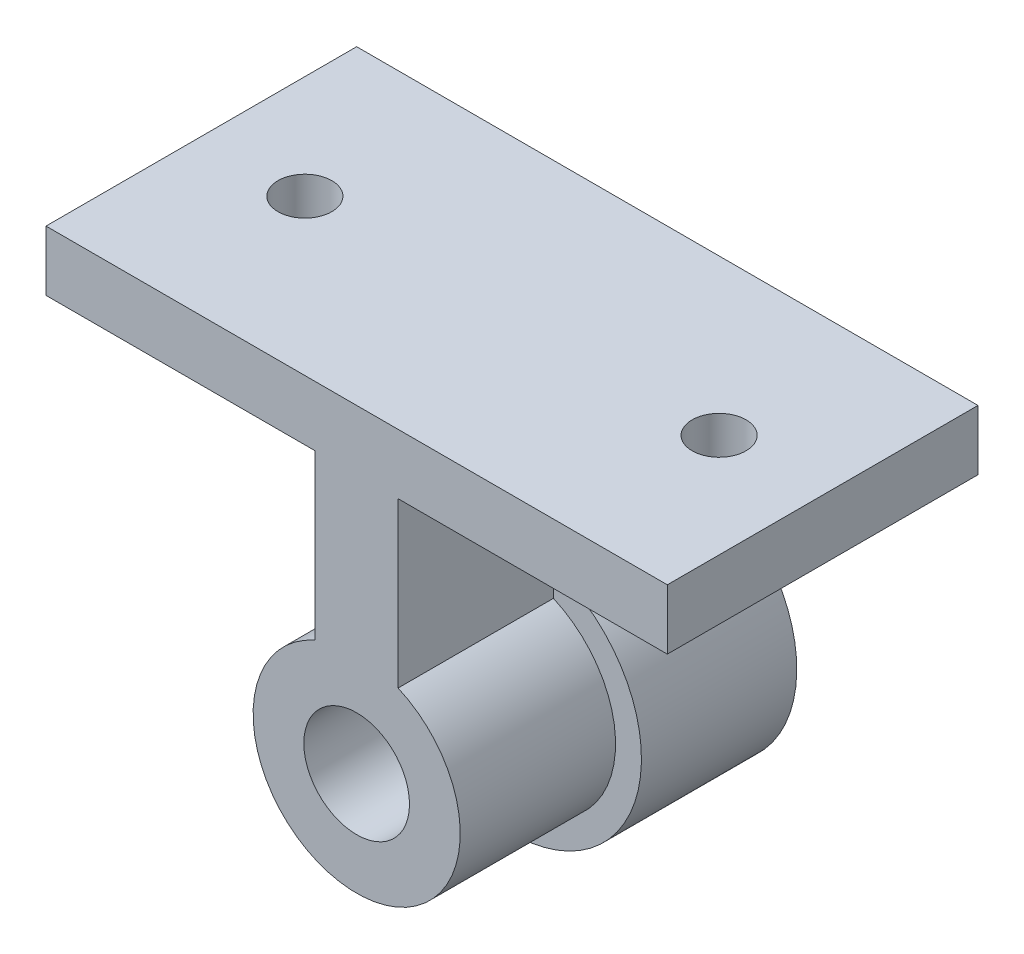
ISO-10303-21;
HEADER;
FILE_DESCRIPTION(('STEP AP214'),'2;1');
FILE_NAME('part.step','',(''),(''),'','','');
FILE_SCHEMA(('AUTOMOTIVE_DESIGN { 1 0 10303 214 1 1 1 1 }'));
ENDSEC;
DATA;
#1=APPLICATION_CONTEXT('core data for automotive mechanical design processes');
#2=APPLICATION_PROTOCOL_DEFINITION('international standard','automotive_design',2000,#1);
#3=PRODUCT_CONTEXT('',#1,'mechanical');
#4=PRODUCT('Part','Part','',(#3));
#5=PRODUCT_RELATED_PRODUCT_CATEGORY('part','',(#4));
#6=PRODUCT_DEFINITION_FORMATION('','',#4);
#7=PRODUCT_DEFINITION_CONTEXT('part definition',#1,'design');
#8=PRODUCT_DEFINITION('design','',#6,#7);
#9=PRODUCT_DEFINITION_SHAPE('','',#8);
#10=(LENGTH_UNIT() NAMED_UNIT(*) SI_UNIT(.MILLI.,.METRE.));
#11=(NAMED_UNIT(*) PLANE_ANGLE_UNIT() SI_UNIT($,.RADIAN.));
#12=(NAMED_UNIT(*) SI_UNIT($,.STERADIAN.) SOLID_ANGLE_UNIT());
#13=UNCERTAINTY_MEASURE_WITH_UNIT(LENGTH_MEASURE(1.E-05),#10,'distance_accuracy_value','');
#14=(GEOMETRIC_REPRESENTATION_CONTEXT(3) GLOBAL_UNCERTAINTY_ASSIGNED_CONTEXT((#13)) GLOBAL_UNIT_ASSIGNED_CONTEXT((#10,
#11,#12)) REPRESENTATION_CONTEXT('',''));
#15=CARTESIAN_POINT('',(0.,0.,0.));
#16=DIRECTION('',(0.,0.,1.));
#17=DIRECTION('',(1.,0.,0.));
#18=AXIS2_PLACEMENT_3D('',#15,#16,#17);
#19=CARTESIAN_POINT('',(0.,-25.,15.));
#20=DIRECTION('',(0.,0.,-1.));
#21=DIRECTION('',(-1.,0.,0.));
#22=AXIS2_PLACEMENT_3D('',#19,#20,#21);
#23=CYLINDRICAL_SURFACE('',#22,5.1);
#24=CARTESIAN_POINT('',(0.,-25.,15.));
#25=DIRECTION('',(0.,0.,1.));
#26=DIRECTION('',(1.,0.,0.));
#27=AXIS2_PLACEMENT_3D('',#24,#25,#26);
#28=CIRCLE('',#27,5.1);
#29=CARTESIAN_POINT('',(5.1,-25.,15.));
#30=VERTEX_POINT('',#29);
#31=EDGE_CURVE('E188',#30,#30,#28,.T.);
#32=ORIENTED_EDGE('',*,*,#31,.T.);
#33=EDGE_LOOP('',(#32));
#34=FACE_BOUND('',#33,.T.);
#35=CARTESIAN_POINT('',(0.,-25.,-4.));
#36=DIRECTION('',(0.,0.,-1.));
#37=DIRECTION('',(-1.,0.,0.));
#38=AXIS2_PLACEMENT_3D('',#35,#36,#37);
#39=CIRCLE('',#38,5.1);
#40=CARTESIAN_POINT('',(-5.1,-25.,-4.));
#41=VERTEX_POINT('',#40);
#42=EDGE_CURVE('E43',#41,#41,#39,.T.);
#43=ORIENTED_EDGE('',*,*,#42,.T.);
#44=EDGE_LOOP('',(#43));
#45=FACE_BOUND('',#44,.T.);
#46=ADVANCED_FACE('F39',(#34,#45),#23,.F.);
#47=CARTESIAN_POINT('',(0.,0.,0.));
#48=DIRECTION('',(0.,1.,0.));
#49=DIRECTION('',(0.,0.,1.));
#50=AXIS2_PLACEMENT_3D('',#47,#48,#49);
#51=PLANE('',#50);
#52=CARTESIAN_POINT('',(-20.,0.,0.));
#53=DIRECTION('',(0.,1.,0.));
#54=DIRECTION('',(0.,0.,1.));
#55=AXIS2_PLACEMENT_3D('',#52,#53,#54);
#56=CIRCLE('',#55,2.6);
#57=CARTESIAN_POINT('',(-20.,0.,2.6));
#58=VERTEX_POINT('',#57);
#59=EDGE_CURVE('E243',#58,#58,#56,.T.);
#60=ORIENTED_EDGE('',*,*,#59,.T.);
#61=EDGE_LOOP('',(#60));
#62=FACE_BOUND('',#61,.T.);
#63=DIRECTION('',(-1.,0.,0.));
#64=VECTOR('',#63,1.);
#65=CARTESIAN_POINT('',(-30.,0.,-15.));
#66=LINE('',#65,#64);
#67=CARTESIAN_POINT('',(-6.,0.,-15.));
#68=VERTEX_POINT('',#67);
#69=CARTESIAN_POINT('',(-30.,0.,-15.));
#70=VERTEX_POINT('',#69);
#71=EDGE_CURVE('E267',#68,#70,#66,.T.);
#72=ORIENTED_EDGE('',*,*,#71,.F.);
#73=DIRECTION('',(0.,0.,1.));
#74=VECTOR('',#73,1.);
#75=CARTESIAN_POINT('',(-6.,0.,-15.));
#76=LINE('',#75,#74);
#77=CARTESIAN_POINT('',(-6.,0.,0.));
#78=VERTEX_POINT('',#77);
#79=EDGE_CURVE('E189',#68,#78,#76,.T.);
#80=ORIENTED_EDGE('',*,*,#79,.T.);
#81=DIRECTION('',(-1.,0.,0.));
#82=VECTOR('',#81,1.);
#83=CARTESIAN_POINT('',(-6.,0.,0.));
#84=LINE('',#83,#82);
#85=CARTESIAN_POINT('',(-4.,0.,0.));
#86=VERTEX_POINT('',#85);
#87=EDGE_CURVE('E183',#86,#78,#84,.T.);
#88=ORIENTED_EDGE('',*,*,#87,.F.);
#89=DIRECTION('',(0.,0.,-1.));
#90=VECTOR('',#89,1.);
#91=CARTESIAN_POINT('',(-4.,0.,15.));
#92=LINE('',#91,#90);
#93=CARTESIAN_POINT('',(-4.,0.,15.));
#94=VERTEX_POINT('',#93);
#95=EDGE_CURVE('E227',#94,#86,#92,.T.);
#96=ORIENTED_EDGE('',*,*,#95,.F.);
#97=DIRECTION('',(1.,0.,0.));
#98=VECTOR('',#97,1.);
#99=CARTESIAN_POINT('',(-30.,0.,15.));
#100=LINE('',#99,#98);
#101=CARTESIAN_POINT('',(-30.,0.,15.));
#102=VERTEX_POINT('',#101);
#103=EDGE_CURVE('E255',#102,#94,#100,.T.);
#104=ORIENTED_EDGE('',*,*,#103,.F.);
#105=DIRECTION('',(0.,0.,1.));
#106=VECTOR('',#105,1.);
#107=CARTESIAN_POINT('',(-30.,0.,-15.));
#108=LINE('',#107,#106);
#109=EDGE_CURVE('E76',#70,#102,#108,.T.);
#110=ORIENTED_EDGE('',*,*,#109,.F.);
#111=EDGE_LOOP('',(#72,#80,#88,#96,#104,#110));
#112=FACE_BOUND('',#111,.T.);
#113=ADVANCED_FACE('F286',(#62,#112),#51,.F.);
#114=CARTESIAN_POINT('',(20.,0.,0.));
#115=DIRECTION('',(0.,-1.,0.));
#116=DIRECTION('',(0.,0.,1.));
#117=AXIS2_PLACEMENT_3D('',#114,#115,#116);
#118=CIRCLE('',#117,2.6);
#119=CARTESIAN_POINT('',(20.,0.,2.6));
#120=VERTEX_POINT('',#119);
#121=EDGE_CURVE('E235',#120,#120,#118,.T.);
#122=ORIENTED_EDGE('',*,*,#121,.F.);
#123=EDGE_LOOP('',(#122));
#124=FACE_BOUND('',#123,.T.);
#125=CARTESIAN_POINT('',(6.,0.,0.));
#126=VERTEX_POINT('',#125);
#127=CARTESIAN_POINT('',(4.,0.,0.));
#128=VERTEX_POINT('',#127);
#129=EDGE_CURVE('E170',#126,#128,#84,.T.);
#130=ORIENTED_EDGE('',*,*,#129,.F.);
#131=DIRECTION('',(0.,0.,1.));
#132=VECTOR('',#131,1.);
#133=CARTESIAN_POINT('',(6.,0.,-15.));
#134=LINE('',#133,#132);
#135=CARTESIAN_POINT('',(6.,0.,-15.));
#136=VERTEX_POINT('',#135);
#137=EDGE_CURVE('E151',#136,#126,#134,.T.);
#138=ORIENTED_EDGE('',*,*,#137,.F.);
#139=CARTESIAN_POINT('',(30.,0.,-15.));
#140=VERTEX_POINT('',#139);
#141=EDGE_CURVE('E160',#140,#136,#66,.T.);
#142=ORIENTED_EDGE('',*,*,#141,.F.);
#143=DIRECTION('',(0.,0.,-1.));
#144=VECTOR('',#143,1.);
#145=CARTESIAN_POINT('',(30.,0.,-15.));
#146=LINE('',#145,#144);
#147=CARTESIAN_POINT('',(30.,0.,15.));
#148=VERTEX_POINT('',#147);
#149=EDGE_CURVE('E251',#148,#140,#146,.T.);
#150=ORIENTED_EDGE('',*,*,#149,.F.);
#151=CARTESIAN_POINT('',(4.,0.,15.));
#152=VERTEX_POINT('',#151);
#153=EDGE_CURVE('E83',#152,#148,#100,.T.);
#154=ORIENTED_EDGE('',*,*,#153,.F.);
#155=DIRECTION('',(0.,0.,-1.));
#156=VECTOR('',#155,1.);
#157=CARTESIAN_POINT('',(4.,0.,15.));
#158=LINE('',#157,#156);
#159=EDGE_CURVE('E231',#152,#128,#158,.T.);
#160=ORIENTED_EDGE('',*,*,#159,.T.);
#161=EDGE_LOOP('',(#130,#138,#142,#150,#154,#160));
#162=FACE_BOUND('',#161,.T.);
#163=ADVANCED_FACE('F318',(#124,#162),#51,.F.);
#164=CARTESIAN_POINT('',(30.,5.8,-15.));
#165=DIRECTION('',(-1.,0.,0.));
#166=DIRECTION('',(0.,0.,1.));
#167=AXIS2_PLACEMENT_3D('',#164,#165,#166);
#168=PLANE('',#167);
#169=ORIENTED_EDGE('',*,*,#149,.T.);
#170=DIRECTION('',(0.,-1.,0.));
#171=VECTOR('',#170,1.);
#172=CARTESIAN_POINT('',(30.,5.8,-15.));
#173=LINE('',#172,#171);
#174=CARTESIAN_POINT('',(30.,5.8,-15.));
#175=VERTEX_POINT('',#174);
#176=EDGE_CURVE('E11',#175,#140,#173,.T.);
#177=ORIENTED_EDGE('',*,*,#176,.F.);
#178=DIRECTION('',(0.,0.,-1.));
#179=VECTOR('',#178,1.);
#180=CARTESIAN_POINT('',(30.,5.8,-15.));
#181=LINE('',#180,#179);
#182=CARTESIAN_POINT('',(30.,5.8,15.));
#183=VERTEX_POINT('',#182);
#184=EDGE_CURVE('E252',#183,#175,#181,.T.);
#185=ORIENTED_EDGE('',*,*,#184,.F.);
#186=DIRECTION('',(0.,-1.,0.));
#187=VECTOR('',#186,1.);
#188=CARTESIAN_POINT('',(30.,5.8,15.));
#189=LINE('',#188,#187);
#190=EDGE_CURVE('E263',#183,#148,#189,.T.);
#191=ORIENTED_EDGE('',*,*,#190,.T.);
#192=EDGE_LOOP('',(#169,#177,#185,#191));
#193=FACE_BOUND('',#192,.T.);
#194=ADVANCED_FACE('F41',(#193),#168,.F.);
#195=CARTESIAN_POINT('',(-30.,5.8,-15.));
#196=DIRECTION('',(0.,0.,1.));
#197=DIRECTION('',(1.,0.,0.));
#198=AXIS2_PLACEMENT_3D('',#195,#196,#197);
#199=PLANE('',#198);
#200=CARTESIAN_POINT('',(0.,-25.,-15.));
#201=DIRECTION('',(0.,0.,-1.));
#202=DIRECTION('',(-1.,0.,0.));
#203=AXIS2_PLACEMENT_3D('',#200,#201,#202);
#204=CIRCLE('',#203,10.75);
#205=CARTESIAN_POINT('',(-10.75,-25.,-15.));
#206=VERTEX_POINT('',#205);
#207=EDGE_CURVE('E173',#206,#206,#204,.T.);
#208=ORIENTED_EDGE('',*,*,#207,.F.);
#209=EDGE_LOOP('',(#208));
#210=FACE_BOUND('',#209,.T.);
#211=ORIENTED_EDGE('',*,*,#141,.T.);
#212=DIRECTION('',(0.,1.,0.));
#213=VECTOR('',#212,1.);
#214=CARTESIAN_POINT('',(6.,-14.0341439002693,-15.));
#215=LINE('',#214,#213);
#216=CARTESIAN_POINT('',(6.,-14.0341439002693,-15.));
#217=VERTEX_POINT('',#216);
#218=EDGE_CURVE('E142',#217,#136,#215,.T.);
#219=ORIENTED_EDGE('',*,*,#218,.F.);
#220=CARTESIAN_POINT('',(0.,-25.,-15.));
#221=DIRECTION('',(0.,0.,1.));
#222=DIRECTION('',(1.,0.,0.));
#223=AXIS2_PLACEMENT_3D('',#220,#221,#222);
#224=CIRCLE('',#223,12.5);
#225=CARTESIAN_POINT('',(-6.,-14.0341439002693,-15.));
#226=VERTEX_POINT('',#225);
#227=EDGE_CURVE('E158',#226,#217,#224,.T.);
#228=ORIENTED_EDGE('',*,*,#227,.F.);
#229=DIRECTION('',(0.,-1.,0.));
#230=VECTOR('',#229,1.);
#231=CARTESIAN_POINT('',(-6.,-14.0341439002693,-15.));
#232=LINE('',#231,#230);
#233=EDGE_CURVE('E152',#68,#226,#232,.T.);
#234=ORIENTED_EDGE('',*,*,#233,.F.);
#235=ORIENTED_EDGE('',*,*,#71,.T.);
#236=DIRECTION('',(0.,-1.,0.));
#237=VECTOR('',#236,1.);
#238=CARTESIAN_POINT('',(-30.,5.8,-15.));
#239=LINE('',#238,#237);
#240=CARTESIAN_POINT('',(-30.,5.8,-15.));
#241=VERTEX_POINT('',#240);
#242=EDGE_CURVE('E50',#241,#70,#239,.T.);
#243=ORIENTED_EDGE('',*,*,#242,.F.);
#244=DIRECTION('',(-1.,0.,0.));
#245=VECTOR('',#244,1.);
#246=CARTESIAN_POINT('',(-30.,5.8,-15.));
#247=LINE('',#246,#245);
#248=EDGE_CURVE('E90',#175,#241,#247,.T.);
#249=ORIENTED_EDGE('',*,*,#248,.F.);
#250=ORIENTED_EDGE('',*,*,#176,.T.);
#251=EDGE_LOOP('',(#211,#219,#228,#234,#235,#243,#249,#250));
#252=FACE_BOUND('',#251,.T.);
#253=ADVANCED_FACE('F156',(#210,#252),#199,.F.);
#254=CARTESIAN_POINT('',(-30.,5.8,-15.));
#255=DIRECTION('',(1.,0.,0.));
#256=DIRECTION('',(0.,0.,-1.));
#257=AXIS2_PLACEMENT_3D('',#254,#255,#256);
#258=PLANE('',#257);
#259=ORIENTED_EDGE('',*,*,#109,.T.);
#260=DIRECTION('',(0.,-1.,0.));
#261=VECTOR('',#260,1.);
#262=CARTESIAN_POINT('',(-30.,5.8,15.));
#263=LINE('',#262,#261);
#264=CARTESIAN_POINT('',(-30.,5.8,15.));
#265=VERTEX_POINT('',#264);
#266=EDGE_CURVE('E277',#265,#102,#263,.T.);
#267=ORIENTED_EDGE('',*,*,#266,.F.);
#268=DIRECTION('',(0.,0.,1.));
#269=VECTOR('',#268,1.);
#270=CARTESIAN_POINT('',(-30.,5.8,-15.));
#271=LINE('',#270,#269);
#272=EDGE_CURVE('E258',#241,#265,#271,.T.);
#273=ORIENTED_EDGE('',*,*,#272,.F.);
#274=ORIENTED_EDGE('',*,*,#242,.T.);
#275=EDGE_LOOP('',(#259,#267,#273,#274));
#276=FACE_BOUND('',#275,.T.);
#277=ADVANCED_FACE('F282',(#276),#258,.F.);
#278=CARTESIAN_POINT('',(-30.,5.8,15.));
#279=DIRECTION('',(0.,0.,-1.));
#280=DIRECTION('',(-1.,0.,0.));
#281=AXIS2_PLACEMENT_3D('',#278,#279,#280);
#282=PLANE('',#281);
#283=ORIENTED_EDGE('',*,*,#103,.T.);
#284=DIRECTION('',(0.,-1.,0.));
#285=VECTOR('',#284,1.);
#286=CARTESIAN_POINT('',(-4.,-15.8348486100883,15.));
#287=LINE('',#286,#285);
#288=CARTESIAN_POINT('',(-4.,-15.8348486100883,15.));
#289=VERTEX_POINT('',#288);
#290=EDGE_CURVE('E202',#94,#289,#287,.T.);
#291=ORIENTED_EDGE('',*,*,#290,.T.);
#292=CARTESIAN_POINT('',(0.,-25.,15.));
#293=DIRECTION('',(0.,0.,1.));
#294=DIRECTION('',(1.,0.,0.));
#295=AXIS2_PLACEMENT_3D('',#292,#293,#294);
#296=CIRCLE('',#295,10.);
#297=CARTESIAN_POINT('',(4.,-15.8348486100883,15.));
#298=VERTEX_POINT('',#297);
#299=EDGE_CURVE('E206',#289,#298,#296,.T.);
#300=ORIENTED_EDGE('',*,*,#299,.T.);
#301=DIRECTION('',(0.,1.,0.));
#302=VECTOR('',#301,1.);
#303=CARTESIAN_POINT('',(4.,-15.8348486100883,15.));
#304=LINE('',#303,#302);
#305=EDGE_CURVE('E199',#298,#152,#304,.T.);
#306=ORIENTED_EDGE('',*,*,#305,.T.);
#307=ORIENTED_EDGE('',*,*,#153,.T.);
#308=ORIENTED_EDGE('',*,*,#190,.F.);
#309=DIRECTION('',(1.,0.,0.));
#310=VECTOR('',#309,1.);
#311=CARTESIAN_POINT('',(-30.,5.8,15.));
#312=LINE('',#311,#310);
#313=EDGE_CURVE('E58',#265,#183,#312,.T.);
#314=ORIENTED_EDGE('',*,*,#313,.F.);
#315=ORIENTED_EDGE('',*,*,#266,.T.);
#316=EDGE_LOOP('',(#283,#291,#300,#306,#307,#308,#314,#315));
#317=FACE_BOUND('',#316,.T.);
#318=ORIENTED_EDGE('',*,*,#31,.F.);
#319=EDGE_LOOP('',(#318));
#320=FACE_BOUND('',#319,.T.);
#321=ADVANCED_FACE('F289',(#317,#320),#282,.F.);
#322=CARTESIAN_POINT('',(0.,5.8,0.));
#323=DIRECTION('',(0.,1.,0.));
#324=DIRECTION('',(0.,0.,1.));
#325=AXIS2_PLACEMENT_3D('',#322,#323,#324);
#326=PLANE('',#325);
#327=CARTESIAN_POINT('',(20.,5.8,0.));
#328=DIRECTION('',(0.,1.,0.));
#329=DIRECTION('',(0.,0.,1.));
#330=AXIS2_PLACEMENT_3D('',#327,#328,#329);
#331=CIRCLE('',#330,2.6);
#332=CARTESIAN_POINT('',(20.,5.8,2.6));
#333=VERTEX_POINT('',#332);
#334=EDGE_CURVE('E239',#333,#333,#331,.T.);
#335=ORIENTED_EDGE('',*,*,#334,.F.);
#336=EDGE_LOOP('',(#335));
#337=FACE_BOUND('',#336,.T.);
#338=CARTESIAN_POINT('',(-20.,5.8,0.));
#339=DIRECTION('',(0.,1.,0.));
#340=DIRECTION('',(0.,0.,1.));
#341=AXIS2_PLACEMENT_3D('',#338,#339,#340);
#342=CIRCLE('',#341,2.6);
#343=CARTESIAN_POINT('',(-20.,5.8,2.6));
#344=VERTEX_POINT('',#343);
#345=EDGE_CURVE('E247',#344,#344,#342,.F.);
#346=ORIENTED_EDGE('',*,*,#345,.T.);
#347=EDGE_LOOP('',(#346));
#348=FACE_BOUND('',#347,.T.);
#349=ORIENTED_EDGE('',*,*,#184,.T.);
#350=ORIENTED_EDGE('',*,*,#248,.T.);
#351=ORIENTED_EDGE('',*,*,#272,.T.);
#352=ORIENTED_EDGE('',*,*,#313,.T.);
#353=EDGE_LOOP('',(#349,#350,#351,#352));
#354=FACE_BOUND('',#353,.T.);
#355=ADVANCED_FACE('F296',(#337,#348,#354),#326,.T.);
#356=CARTESIAN_POINT('',(-20.,6.,0.));
#357=DIRECTION('',(0.,-1.,0.));
#358=DIRECTION('',(0.,0.,-1.));
#359=AXIS2_PLACEMENT_3D('',#356,#357,#358);
#360=CYLINDRICAL_SURFACE('',#359,2.6);
#361=ORIENTED_EDGE('',*,*,#345,.F.);
#362=EDGE_LOOP('',(#361));
#363=FACE_BOUND('',#362,.T.);
#364=ORIENTED_EDGE('',*,*,#59,.F.);
#365=EDGE_LOOP('',(#364));
#366=FACE_BOUND('',#365,.T.);
#367=ADVANCED_FACE('F298',(#363,#366),#360,.F.);
#368=CARTESIAN_POINT('',(20.,6.,0.));
#369=DIRECTION('',(0.,-1.,0.));
#370=DIRECTION('',(0.,0.,-1.));
#371=AXIS2_PLACEMENT_3D('',#368,#369,#370);
#372=CYLINDRICAL_SURFACE('',#371,2.6);
#373=ORIENTED_EDGE('',*,*,#334,.T.);
#374=EDGE_LOOP('',(#373));
#375=FACE_BOUND('',#374,.T.);
#376=ORIENTED_EDGE('',*,*,#121,.T.);
#377=EDGE_LOOP('',(#376));
#378=FACE_BOUND('',#377,.T.);
#379=ADVANCED_FACE('F305',(#375,#378),#372,.F.);
#380=CARTESIAN_POINT('',(4.,-15.8348486100883,15.));
#381=DIRECTION('',(-1.,0.,0.));
#382=DIRECTION('',(0.,0.,1.));
#383=AXIS2_PLACEMENT_3D('',#380,#381,#382);
#384=PLANE('',#383);
#385=DIRECTION('',(0.,1.,0.));
#386=VECTOR('',#385,1.);
#387=CARTESIAN_POINT('',(4.,-15.8348486100883,0.));
#388=LINE('',#387,#386);
#389=CARTESIAN_POINT('',(4.,-15.8348486100883,0.));
#390=VERTEX_POINT('',#389);
#391=EDGE_CURVE('E198',#390,#128,#388,.T.);
#392=ORIENTED_EDGE('',*,*,#391,.T.);
#393=ORIENTED_EDGE('',*,*,#159,.F.);
#394=ORIENTED_EDGE('',*,*,#305,.F.);
#395=DIRECTION('',(0.,0.,-1.));
#396=VECTOR('',#395,1.);
#397=CARTESIAN_POINT('',(4.,-15.8348486100883,15.));
#398=LINE('',#397,#396);
#399=EDGE_CURVE('E209',#298,#390,#398,.T.);
#400=ORIENTED_EDGE('',*,*,#399,.T.);
#401=EDGE_LOOP('',(#392,#393,#394,#400));
#402=FACE_BOUND('',#401,.T.);
#403=ADVANCED_FACE('F332',(#402),#384,.F.);
#404=CARTESIAN_POINT('',(-4.,-15.8348486100883,15.));
#405=DIRECTION('',(1.,0.,0.));
#406=DIRECTION('',(0.,1.,0.));
#407=AXIS2_PLACEMENT_3D('',#404,#405,#406);
#408=PLANE('',#407);
#409=DIRECTION('',(0.,-1.,0.));
#410=VECTOR('',#409,1.);
#411=CARTESIAN_POINT('',(-4.,-15.8348486100883,0.));
#412=LINE('',#411,#410);
#413=CARTESIAN_POINT('',(-4.,-15.8348486100883,0.));
#414=VERTEX_POINT('',#413);
#415=EDGE_CURVE('E213',#86,#414,#412,.T.);
#416=ORIENTED_EDGE('',*,*,#415,.T.);
#417=DIRECTION('',(0.,0.,-1.));
#418=VECTOR('',#417,1.);
#419=CARTESIAN_POINT('',(-4.,-15.8348486100883,15.));
#420=LINE('',#419,#418);
#421=EDGE_CURVE('E223',#289,#414,#420,.T.);
#422=ORIENTED_EDGE('',*,*,#421,.F.);
#423=ORIENTED_EDGE('',*,*,#290,.F.);
#424=ORIENTED_EDGE('',*,*,#95,.T.);
#425=EDGE_LOOP('',(#416,#422,#423,#424));
#426=FACE_BOUND('',#425,.T.);
#427=ADVANCED_FACE('F328',(#426),#408,.F.);
#428=CARTESIAN_POINT('',(0.,-25.,15.));
#429=DIRECTION('',(0.,0.,-1.));
#430=DIRECTION('',(-1.,0.,0.));
#431=AXIS2_PLACEMENT_3D('',#428,#429,#430);
#432=CYLINDRICAL_SURFACE('',#431,10.);
#433=CARTESIAN_POINT('',(0.,-25.,0.));
#434=DIRECTION('',(0.,0.,1.));
#435=DIRECTION('',(1.,0.,0.));
#436=AXIS2_PLACEMENT_3D('',#433,#434,#435);
#437=CIRCLE('',#436,10.);
#438=EDGE_CURVE('E203',#414,#390,#437,.T.);
#439=ORIENTED_EDGE('',*,*,#438,.T.);
#440=ORIENTED_EDGE('',*,*,#399,.F.);
#441=ORIENTED_EDGE('',*,*,#299,.F.);
#442=ORIENTED_EDGE('',*,*,#421,.T.);
#443=EDGE_LOOP('',(#439,#440,#441,#442));
#444=FACE_BOUND('',#443,.T.);
#445=ADVANCED_FACE('F324',(#444),#432,.T.);
#446=CARTESIAN_POINT('',(0.,-25.,0.));
#447=DIRECTION('',(0.,0.,1.));
#448=DIRECTION('',(1.,0.,0.));
#449=AXIS2_PLACEMENT_3D('',#446,#447,#448);
#450=PLANE('',#449);
#451=ORIENTED_EDGE('',*,*,#391,.F.);
#452=ORIENTED_EDGE('',*,*,#438,.F.);
#453=ORIENTED_EDGE('',*,*,#415,.F.);
#454=ORIENTED_EDGE('',*,*,#87,.T.);
#455=DIRECTION('',(0.,-1.,0.));
#456=VECTOR('',#455,1.);
#457=CARTESIAN_POINT('',(-6.,-14.0341439002693,0.));
#458=LINE('',#457,#456);
#459=CARTESIAN_POINT('',(-6.,-14.0341439002693,0.));
#460=VERTEX_POINT('',#459);
#461=EDGE_CURVE('E166',#78,#460,#458,.T.);
#462=ORIENTED_EDGE('',*,*,#461,.T.);
#463=CARTESIAN_POINT('',(0.,-25.,0.));
#464=DIRECTION('',(0.,0.,1.));
#465=DIRECTION('',(1.,0.,0.));
#466=AXIS2_PLACEMENT_3D('',#463,#464,#465);
#467=CIRCLE('',#466,12.5);
#468=CARTESIAN_POINT('',(6.,-14.0341439002693,0.));
#469=VERTEX_POINT('',#468);
#470=EDGE_CURVE('E178',#460,#469,#467,.T.);
#471=ORIENTED_EDGE('',*,*,#470,.T.);
#472=DIRECTION('',(0.,1.,0.));
#473=VECTOR('',#472,1.);
#474=CARTESIAN_POINT('',(6.,-14.0341439002693,0.));
#475=LINE('',#474,#473);
#476=EDGE_CURVE('E145',#469,#126,#475,.T.);
#477=ORIENTED_EDGE('',*,*,#476,.T.);
#478=ORIENTED_EDGE('',*,*,#129,.T.);
#479=EDGE_LOOP('',(#451,#452,#453,#454,#462,#471,#477,#478));
#480=FACE_BOUND('',#479,.T.);
#481=ADVANCED_FACE('F327',(#480),#450,.T.);
#482=CARTESIAN_POINT('',(0.,-25.,-15.));
#483=DIRECTION('',(0.,0.,1.));
#484=DIRECTION('',(1.,0.,0.));
#485=AXIS2_PLACEMENT_3D('',#482,#483,#484);
#486=CYLINDRICAL_SURFACE('',#485,12.5);
#487=ORIENTED_EDGE('',*,*,#470,.F.);
#488=DIRECTION('',(0.,0.,1.));
#489=VECTOR('',#488,1.);
#490=CARTESIAN_POINT('',(-6.,-14.0341439002693,-15.));
#491=LINE('',#490,#489);
#492=EDGE_CURVE('E164',#226,#460,#491,.T.);
#493=ORIENTED_EDGE('',*,*,#492,.F.);
#494=ORIENTED_EDGE('',*,*,#227,.T.);
#495=DIRECTION('',(0.,0.,1.));
#496=VECTOR('',#495,1.);
#497=CARTESIAN_POINT('',(6.,-14.0341439002693,-15.));
#498=LINE('',#497,#496);
#499=EDGE_CURVE('E139',#217,#469,#498,.T.);
#500=ORIENTED_EDGE('',*,*,#499,.T.);
#501=EDGE_LOOP('',(#487,#493,#494,#500));
#502=FACE_BOUND('',#501,.T.);
#503=ADVANCED_FACE('F163',(#502),#486,.T.);
#504=CARTESIAN_POINT('',(-6.,-14.0341439002693,-15.));
#505=DIRECTION('',(-1.,0.,0.));
#506=DIRECTION('',(0.,0.,1.));
#507=AXIS2_PLACEMENT_3D('',#504,#505,#506);
#508=PLANE('',#507);
#509=ORIENTED_EDGE('',*,*,#461,.F.);
#510=ORIENTED_EDGE('',*,*,#79,.F.);
#511=ORIENTED_EDGE('',*,*,#233,.T.);
#512=ORIENTED_EDGE('',*,*,#492,.T.);
#513=EDGE_LOOP('',(#509,#510,#511,#512));
#514=FACE_BOUND('',#513,.T.);
#515=ADVANCED_FACE('F441',(#514),#508,.T.);
#516=CARTESIAN_POINT('',(6.,-14.0341439002693,-15.));
#517=DIRECTION('',(1.,0.,0.));
#518=DIRECTION('',(0.,1.,0.));
#519=AXIS2_PLACEMENT_3D('',#516,#517,#518);
#520=PLANE('',#519);
#521=ORIENTED_EDGE('',*,*,#476,.F.);
#522=ORIENTED_EDGE('',*,*,#499,.F.);
#523=ORIENTED_EDGE('',*,*,#218,.T.);
#524=ORIENTED_EDGE('',*,*,#137,.T.);
#525=EDGE_LOOP('',(#521,#522,#523,#524));
#526=FACE_BOUND('',#525,.T.);
#527=ADVANCED_FACE('F141',(#526),#520,.T.);
#528=CARTESIAN_POINT('',(0.,-25.,-4.));
#529=DIRECTION('',(0.,0.,-1.));
#530=DIRECTION('',(-1.,0.,0.));
#531=AXIS2_PLACEMENT_3D('',#528,#529,#530);
#532=CYLINDRICAL_SURFACE('',#531,10.75);
#533=CARTESIAN_POINT('',(0.,-25.,-4.));
#534=DIRECTION('',(0.,0.,-1.));
#535=DIRECTION('',(-1.,0.,0.));
#536=AXIS2_PLACEMENT_3D('',#533,#534,#535);
#537=CIRCLE('',#536,10.75);
#538=CARTESIAN_POINT('',(-10.75,-25.,-4.));
#539=VERTEX_POINT('',#538);
#540=EDGE_CURVE('E357',#539,#539,#537,.T.);
#541=ORIENTED_EDGE('',*,*,#540,.F.);
#542=EDGE_LOOP('',(#541));
#543=FACE_BOUND('',#542,.T.);
#544=ORIENTED_EDGE('',*,*,#207,.T.);
#545=EDGE_LOOP('',(#544));
#546=FACE_BOUND('',#545,.T.);
#547=ADVANCED_FACE('F363',(#543,#546),#532,.F.);
#548=CARTESIAN_POINT('',(0.,-25.,-4.));
#549=DIRECTION('',(0.,0.,-1.));
#550=DIRECTION('',(-1.,0.,0.));
#551=AXIS2_PLACEMENT_3D('',#548,#549,#550);
#552=PLANE('',#551);
#553=ORIENTED_EDGE('',*,*,#42,.F.);
#554=EDGE_LOOP('',(#553));
#555=FACE_BOUND('',#554,.T.);
#556=ORIENTED_EDGE('',*,*,#540,.T.);
#557=EDGE_LOOP('',(#556));
#558=FACE_BOUND('',#557,.T.);
#559=ADVANCED_FACE('F468',(#555,#558),#552,.T.);
#560=CLOSED_SHELL('',(#46,#113,#163,#194,#253,#277,#321,#355,#367,#379,#403,#427,#445,#481,#503,
#515,#527,#547,#559));
#561=MANIFOLD_SOLID_BREP('B2',#560);
#562=ADVANCED_BREP_SHAPE_REPRESENTATION('',(#18,#561),#14);
#563=SHAPE_DEFINITION_REPRESENTATION(#9,#562);
ENDSEC;
END-ISO-10303-21;
